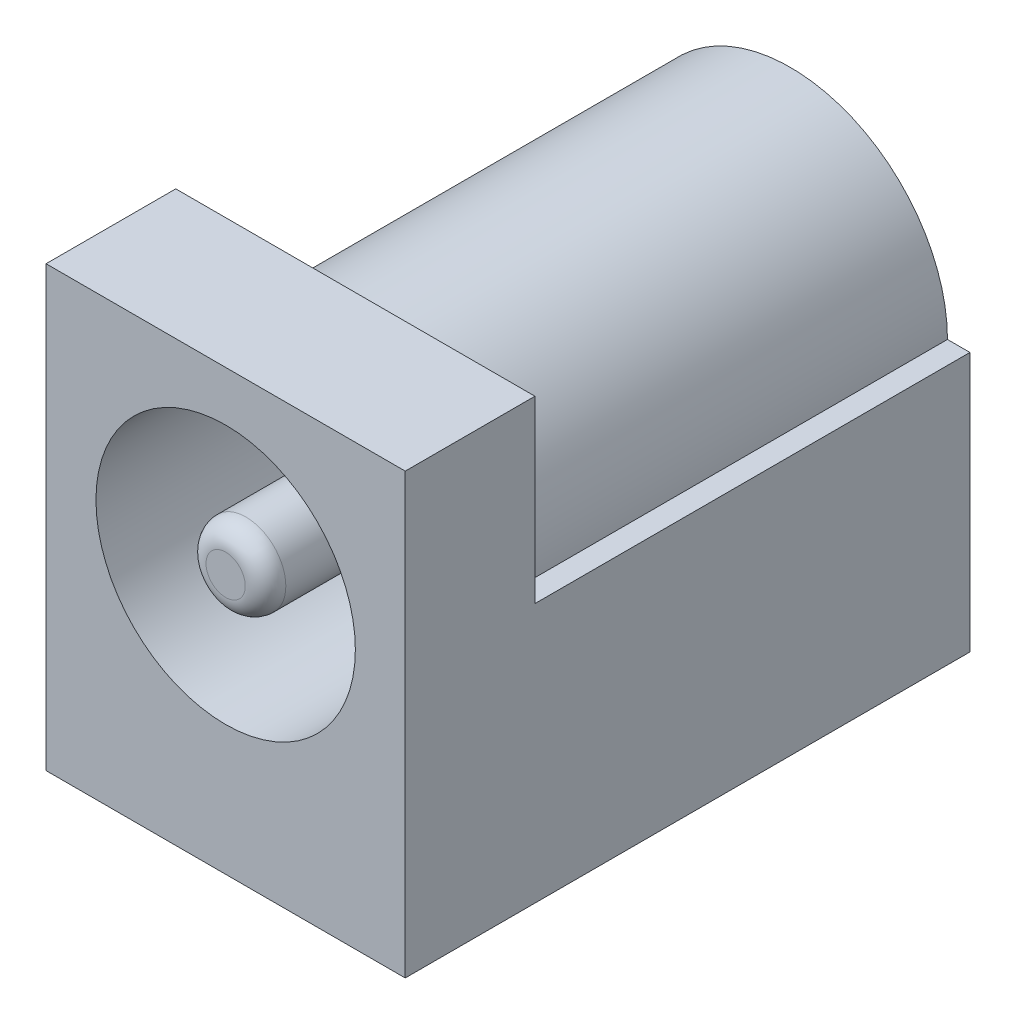
ISO-10303-21;
HEADER;
FILE_DESCRIPTION(('STEP AP214'),'2;1');
FILE_NAME('part.step','',(''),(''),'','','');
FILE_SCHEMA(('AUTOMOTIVE_DESIGN { 1 0 10303 214 1 1 1 1 }'));
ENDSEC;
DATA;
#1=APPLICATION_CONTEXT('core data for automotive mechanical design processes');
#2=APPLICATION_PROTOCOL_DEFINITION('international standard','automotive_design',2000,#1);
#3=PRODUCT_CONTEXT('',#1,'mechanical');
#4=PRODUCT('Part','Part','',(#3));
#5=PRODUCT_RELATED_PRODUCT_CATEGORY('part','',(#4));
#6=PRODUCT_DEFINITION_FORMATION('','',#4);
#7=PRODUCT_DEFINITION_CONTEXT('part definition',#1,'design');
#8=PRODUCT_DEFINITION('design','',#6,#7);
#9=PRODUCT_DEFINITION_SHAPE('','',#8);
#10=(LENGTH_UNIT() NAMED_UNIT(*) SI_UNIT(.MILLI.,.METRE.));
#11=(NAMED_UNIT(*) PLANE_ANGLE_UNIT() SI_UNIT($,.RADIAN.));
#12=(NAMED_UNIT(*) SI_UNIT($,.STERADIAN.) SOLID_ANGLE_UNIT());
#13=UNCERTAINTY_MEASURE_WITH_UNIT(LENGTH_MEASURE(1.E-05),#10,'distance_accuracy_value','');
#14=(GEOMETRIC_REPRESENTATION_CONTEXT(3) GLOBAL_UNCERTAINTY_ASSIGNED_CONTEXT((#13)) GLOBAL_UNIT_ASSIGNED_CONTEXT((#10,
#11,#12)) REPRESENTATION_CONTEXT('',''));
#15=CARTESIAN_POINT('',(0.,0.,0.));
#16=DIRECTION('',(0.,0.,1.));
#17=DIRECTION('',(1.,0.,0.));
#18=AXIS2_PLACEMENT_3D('',#15,#16,#17);
#19=CARTESIAN_POINT('',(4.5,-5.5,3.25));
#20=DIRECTION('',(-1.,0.,0.));
#21=DIRECTION('',(0.,0.,1.));
#22=AXIS2_PLACEMENT_3D('',#19,#20,#21);
#23=PLANE('',#22);
#24=DIRECTION('',(0.,0.,-1.));
#25=VECTOR('',#24,1.);
#26=CARTESIAN_POINT('',(4.5,-5.5,3.25));
#27=LINE('',#26,#25);
#28=CARTESIAN_POINT('',(4.5,-5.5,3.25));
#29=VERTEX_POINT('',#28);
#30=CARTESIAN_POINT('',(4.5,-5.5,-10.9));
#31=VERTEX_POINT('',#30);
#32=EDGE_CURVE('E99',#29,#31,#27,.T.);
#33=ORIENTED_EDGE('',*,*,#32,.T.);
#34=DIRECTION('',(0.,-1.,0.));
#35=VECTOR('',#34,1.);
#36=CARTESIAN_POINT('',(4.5,1.,-10.9));
#37=LINE('',#36,#35);
#38=CARTESIAN_POINT('',(4.5,1.,-10.9));
#39=VERTEX_POINT('',#38);
#40=EDGE_CURVE('E103',#39,#31,#37,.T.);
#41=ORIENTED_EDGE('',*,*,#40,.F.);
#42=DIRECTION('',(0.,0.,1.));
#43=VECTOR('',#42,1.);
#44=CARTESIAN_POINT('',(4.5,1.,-10.9));
#45=LINE('',#44,#43);
#46=CARTESIAN_POINT('',(4.5,1.,0.));
#47=VERTEX_POINT('',#46);
#48=EDGE_CURVE('E137',#39,#47,#45,.T.);
#49=ORIENTED_EDGE('',*,*,#48,.T.);
#50=DIRECTION('',(0.,1.,0.));
#51=VECTOR('',#50,1.);
#52=CARTESIAN_POINT('',(4.5,-5.5,0.));
#53=LINE('',#52,#51);
#54=CARTESIAN_POINT('',(4.5,5.5,0.));
#55=VERTEX_POINT('',#54);
#56=EDGE_CURVE('E161',#47,#55,#53,.T.);
#57=ORIENTED_EDGE('',*,*,#56,.T.);
#58=DIRECTION('',(0.,0.,-1.));
#59=VECTOR('',#58,1.);
#60=CARTESIAN_POINT('',(4.5,5.5,3.25));
#61=LINE('',#60,#59);
#62=CARTESIAN_POINT('',(4.5,5.5,3.25));
#63=VERTEX_POINT('',#62);
#64=EDGE_CURVE('E150',#63,#55,#61,.T.);
#65=ORIENTED_EDGE('',*,*,#64,.F.);
#66=DIRECTION('',(0.,1.,0.));
#67=VECTOR('',#66,1.);
#68=CARTESIAN_POINT('',(4.5,-5.5,3.25));
#69=LINE('',#68,#67);
#70=EDGE_CURVE('E106',#29,#63,#69,.T.);
#71=ORIENTED_EDGE('',*,*,#70,.F.);
#72=EDGE_LOOP('',(#33,#41,#49,#57,#65,#71));
#73=FACE_BOUND('',#72,.T.);
#74=ADVANCED_FACE('F33',(#73),#23,.F.);
#75=CARTESIAN_POINT('',(-4.5,5.5,3.25));
#76=DIRECTION('',(0.,-1.,0.));
#77=DIRECTION('',(0.,0.,-1.));
#78=AXIS2_PLACEMENT_3D('',#75,#76,#77);
#79=PLANE('',#78);
#80=DIRECTION('',(-1.,0.,0.));
#81=VECTOR('',#80,1.);
#82=CARTESIAN_POINT('',(-4.5,5.5,0.));
#83=LINE('',#82,#81);
#84=CARTESIAN_POINT('',(-4.5,5.5,0.));
#85=VERTEX_POINT('',#84);
#86=EDGE_CURVE('E164',#55,#85,#83,.T.);
#87=ORIENTED_EDGE('',*,*,#86,.T.);
#88=DIRECTION('',(0.,0.,-1.));
#89=VECTOR('',#88,1.);
#90=CARTESIAN_POINT('',(-4.5,5.5,3.25));
#91=LINE('',#90,#89);
#92=CARTESIAN_POINT('',(-4.5,5.5,3.25));
#93=VERTEX_POINT('',#92);
#94=EDGE_CURVE('E154',#93,#85,#91,.T.);
#95=ORIENTED_EDGE('',*,*,#94,.F.);
#96=DIRECTION('',(-1.,0.,0.));
#97=VECTOR('',#96,1.);
#98=CARTESIAN_POINT('',(-4.5,5.5,3.25));
#99=LINE('',#98,#97);
#100=EDGE_CURVE('E179',#63,#93,#99,.T.);
#101=ORIENTED_EDGE('',*,*,#100,.F.);
#102=ORIENTED_EDGE('',*,*,#64,.T.);
#103=EDGE_LOOP('',(#87,#95,#101,#102));
#104=FACE_BOUND('',#103,.T.);
#105=ADVANCED_FACE('F205',(#104),#79,.F.);
#106=CARTESIAN_POINT('',(-4.5,-5.5,3.25));
#107=DIRECTION('',(1.,0.,0.));
#108=DIRECTION('',(0.,0.,-1.));
#109=AXIS2_PLACEMENT_3D('',#106,#107,#108);
#110=PLANE('',#109);
#111=DIRECTION('',(0.,-1.,0.));
#112=VECTOR('',#111,1.);
#113=CARTESIAN_POINT('',(-4.5,-5.5,0.));
#114=LINE('',#113,#112);
#115=CARTESIAN_POINT('',(-4.5,1.,0.));
#116=VERTEX_POINT('',#115);
#117=EDGE_CURVE('E166',#85,#116,#114,.T.);
#118=ORIENTED_EDGE('',*,*,#117,.T.);
#119=DIRECTION('',(0.,0.,1.));
#120=VECTOR('',#119,1.);
#121=CARTESIAN_POINT('',(-4.5,1.,-10.9));
#122=LINE('',#121,#120);
#123=CARTESIAN_POINT('',(-4.5,1.,-10.9));
#124=VERTEX_POINT('',#123);
#125=EDGE_CURVE('E165',#124,#116,#122,.T.);
#126=ORIENTED_EDGE('',*,*,#125,.F.);
#127=DIRECTION('',(0.,1.,0.));
#128=VECTOR('',#127,1.);
#129=CARTESIAN_POINT('',(-4.5,1.,-10.9));
#130=LINE('',#129,#128);
#131=CARTESIAN_POINT('',(-4.5,-5.5,-10.9));
#132=VERTEX_POINT('',#131);
#133=EDGE_CURVE('E118',#132,#124,#130,.T.);
#134=ORIENTED_EDGE('',*,*,#133,.F.);
#135=DIRECTION('',(0.,0.,-1.));
#136=VECTOR('',#135,1.);
#137=CARTESIAN_POINT('',(-4.5,-5.5,3.25));
#138=LINE('',#137,#136);
#139=CARTESIAN_POINT('',(-4.5,-5.5,3.25));
#140=VERTEX_POINT('',#139);
#141=EDGE_CURVE('E109',#140,#132,#138,.T.);
#142=ORIENTED_EDGE('',*,*,#141,.F.);
#143=DIRECTION('',(0.,-1.,0.));
#144=VECTOR('',#143,1.);
#145=CARTESIAN_POINT('',(-4.5,-5.5,3.25));
#146=LINE('',#145,#144);
#147=EDGE_CURVE('E182',#93,#140,#146,.T.);
#148=ORIENTED_EDGE('',*,*,#147,.F.);
#149=ORIENTED_EDGE('',*,*,#94,.T.);
#150=EDGE_LOOP('',(#118,#126,#134,#142,#148,#149));
#151=FACE_BOUND('',#150,.T.);
#152=ADVANCED_FACE('F198',(#151),#110,.F.);
#153=CARTESIAN_POINT('',(-4.5,-5.5,3.25));
#154=DIRECTION('',(0.,1.,0.));
#155=DIRECTION('',(0.,0.,1.));
#156=AXIS2_PLACEMENT_3D('',#153,#154,#155);
#157=PLANE('',#156);
#158=ORIENTED_EDGE('',*,*,#141,.T.);
#159=DIRECTION('',(-1.,0.,0.));
#160=VECTOR('',#159,1.);
#161=CARTESIAN_POINT('',(4.5,-5.5,-10.9));
#162=LINE('',#161,#160);
#163=EDGE_CURVE('E113',#31,#132,#162,.T.);
#164=ORIENTED_EDGE('',*,*,#163,.F.);
#165=ORIENTED_EDGE('',*,*,#32,.F.);
#166=DIRECTION('',(1.,0.,0.));
#167=VECTOR('',#166,1.);
#168=CARTESIAN_POINT('',(-4.5,-5.5,3.25));
#169=LINE('',#168,#167);
#170=EDGE_CURVE('E110',#140,#29,#169,.T.);
#171=ORIENTED_EDGE('',*,*,#170,.F.);
#172=EDGE_LOOP('',(#158,#164,#165,#171));
#173=FACE_BOUND('',#172,.T.);
#174=ADVANCED_FACE('F114',(#173),#157,.F.);
#175=CARTESIAN_POINT('',(0.,0.,3.25));
#176=DIRECTION('',(0.,0.,-1.));
#177=DIRECTION('',(-1.,0.,0.));
#178=AXIS2_PLACEMENT_3D('',#175,#176,#177);
#179=PLANE('',#178);
#180=CARTESIAN_POINT('',(0.,1.,3.25));
#181=DIRECTION('',(0.,0.,1.));
#182=DIRECTION('',(1.,0.,0.));
#183=AXIS2_PLACEMENT_3D('',#180,#181,#182);
#184=CIRCLE('',#183,3.25);
#185=CARTESIAN_POINT('',(3.25,1.,3.25));
#186=VERTEX_POINT('',#185);
#187=EDGE_CURVE('E128',#186,#186,#184,.T.);
#188=ORIENTED_EDGE('',*,*,#187,.F.);
#189=EDGE_LOOP('',(#188));
#190=FACE_BOUND('',#189,.T.);
#191=ORIENTED_EDGE('',*,*,#70,.T.);
#192=ORIENTED_EDGE('',*,*,#100,.T.);
#193=ORIENTED_EDGE('',*,*,#147,.T.);
#194=ORIENTED_EDGE('',*,*,#170,.T.);
#195=EDGE_LOOP('',(#191,#192,#193,#194));
#196=FACE_BOUND('',#195,.T.);
#197=ADVANCED_FACE('F186',(#190,#196),#179,.F.);
#198=CARTESIAN_POINT('',(0.,0.,0.));
#199=DIRECTION('',(0.,0.,-1.));
#200=DIRECTION('',(-1.,0.,0.));
#201=AXIS2_PLACEMENT_3D('',#198,#199,#200);
#202=PLANE('',#201);
#203=DIRECTION('',(1.,0.,0.));
#204=VECTOR('',#203,1.);
#205=CARTESIAN_POINT('',(4.5,1.,0.));
#206=LINE('',#205,#204);
#207=CARTESIAN_POINT('',(3.937,1.,0.));
#208=VERTEX_POINT('',#207);
#209=EDGE_CURVE('E48',#208,#47,#206,.T.);
#210=ORIENTED_EDGE('',*,*,#209,.F.);
#211=CARTESIAN_POINT('',(0.,1.,0.));
#212=DIRECTION('',(0.,0.,-1.));
#213=DIRECTION('',(-1.,0.,0.));
#214=AXIS2_PLACEMENT_3D('',#211,#212,#213);
#215=CIRCLE('',#214,3.937);
#216=CARTESIAN_POINT('',(-3.937,1.,0.));
#217=VERTEX_POINT('',#216);
#218=EDGE_CURVE('E125',#217,#208,#215,.T.);
#219=ORIENTED_EDGE('',*,*,#218,.F.);
#220=DIRECTION('',(1.,0.,0.));
#221=VECTOR('',#220,1.);
#222=CARTESIAN_POINT('',(-3.937,1.,0.));
#223=LINE('',#222,#221);
#224=EDGE_CURVE('E54',#116,#217,#223,.T.);
#225=ORIENTED_EDGE('',*,*,#224,.F.);
#226=ORIENTED_EDGE('',*,*,#117,.F.);
#227=ORIENTED_EDGE('',*,*,#86,.F.);
#228=ORIENTED_EDGE('',*,*,#56,.F.);
#229=EDGE_LOOP('',(#210,#219,#225,#226,#227,#228));
#230=FACE_BOUND('',#229,.T.);
#231=ADVANCED_FACE('F188',(#230),#202,.T.);
#232=CARTESIAN_POINT('',(-3.937,1.,-10.9));
#233=DIRECTION('',(0.,-1.,0.));
#234=DIRECTION('',(0.,0.,-1.));
#235=AXIS2_PLACEMENT_3D('',#232,#233,#234);
#236=PLANE('',#235);
#237=ORIENTED_EDGE('',*,*,#224,.T.);
#238=DIRECTION('',(0.,0.,1.));
#239=VECTOR('',#238,1.);
#240=CARTESIAN_POINT('',(-3.937,1.,-10.9));
#241=LINE('',#240,#239);
#242=CARTESIAN_POINT('',(-3.937,1.,-10.9));
#243=VERTEX_POINT('',#242);
#244=EDGE_CURVE('E184',#243,#217,#241,.T.);
#245=ORIENTED_EDGE('',*,*,#244,.F.);
#246=DIRECTION('',(1.,0.,0.));
#247=VECTOR('',#246,1.);
#248=CARTESIAN_POINT('',(-3.937,1.,-10.9));
#249=LINE('',#248,#247);
#250=EDGE_CURVE('E132',#124,#243,#249,.T.);
#251=ORIENTED_EDGE('',*,*,#250,.F.);
#252=ORIENTED_EDGE('',*,*,#125,.T.);
#253=EDGE_LOOP('',(#237,#245,#251,#252));
#254=FACE_BOUND('',#253,.T.);
#255=ADVANCED_FACE('F196',(#254),#236,.F.);
#256=CARTESIAN_POINT('',(0.,1.,-10.9));
#257=DIRECTION('',(0.,0.,1.));
#258=DIRECTION('',(1.,0.,0.));
#259=AXIS2_PLACEMENT_3D('',#256,#257,#258);
#260=CYLINDRICAL_SURFACE('',#259,3.937);
#261=ORIENTED_EDGE('',*,*,#218,.T.);
#262=DIRECTION('',(0.,0.,1.));
#263=VECTOR('',#262,1.);
#264=CARTESIAN_POINT('',(3.937,1.,-10.9));
#265=LINE('',#264,#263);
#266=CARTESIAN_POINT('',(3.937,1.,-10.9));
#267=VERTEX_POINT('',#266);
#268=EDGE_CURVE('E141',#267,#208,#265,.T.);
#269=ORIENTED_EDGE('',*,*,#268,.F.);
#270=CARTESIAN_POINT('',(0.,1.,-10.9));
#271=DIRECTION('',(0.,0.,-1.));
#272=DIRECTION('',(-1.,0.,0.));
#273=AXIS2_PLACEMENT_3D('',#270,#271,#272);
#274=CIRCLE('',#273,3.937);
#275=EDGE_CURVE('E134',#243,#267,#274,.T.);
#276=ORIENTED_EDGE('',*,*,#275,.F.);
#277=ORIENTED_EDGE('',*,*,#244,.T.);
#278=EDGE_LOOP('',(#261,#269,#276,#277));
#279=FACE_BOUND('',#278,.T.);
#280=ADVANCED_FACE('F238',(#279),#260,.T.);
#281=CARTESIAN_POINT('',(4.5,1.,-10.9));
#282=DIRECTION('',(0.,-1.,0.));
#283=DIRECTION('',(0.,0.,-1.));
#284=AXIS2_PLACEMENT_3D('',#281,#282,#283);
#285=PLANE('',#284);
#286=ORIENTED_EDGE('',*,*,#209,.T.);
#287=ORIENTED_EDGE('',*,*,#48,.F.);
#288=DIRECTION('',(1.,0.,0.));
#289=VECTOR('',#288,1.);
#290=CARTESIAN_POINT('',(4.5,1.,-10.9));
#291=LINE('',#290,#289);
#292=EDGE_CURVE('E122',#267,#39,#291,.T.);
#293=ORIENTED_EDGE('',*,*,#292,.F.);
#294=ORIENTED_EDGE('',*,*,#268,.T.);
#295=EDGE_LOOP('',(#286,#287,#293,#294));
#296=FACE_BOUND('',#295,.T.);
#297=ADVANCED_FACE('F247',(#296),#285,.F.);
#298=CARTESIAN_POINT('',(0.,1.,-10.9));
#299=DIRECTION('',(0.,0.,-1.));
#300=DIRECTION('',(-1.,0.,0.));
#301=AXIS2_PLACEMENT_3D('',#298,#299,#300);
#302=PLANE('',#301);
#303=ORIENTED_EDGE('',*,*,#40,.T.);
#304=ORIENTED_EDGE('',*,*,#163,.T.);
#305=ORIENTED_EDGE('',*,*,#133,.T.);
#306=ORIENTED_EDGE('',*,*,#250,.T.);
#307=ORIENTED_EDGE('',*,*,#275,.T.);
#308=ORIENTED_EDGE('',*,*,#292,.T.);
#309=EDGE_LOOP('',(#303,#304,#305,#306,#307,#308));
#310=FACE_BOUND('',#309,.T.);
#311=ADVANCED_FACE('F120',(#310),#302,.T.);
#312=CARTESIAN_POINT('',(0.,1.,-7.65));
#313=DIRECTION('',(0.,0.,1.));
#314=DIRECTION('',(1.,0.,0.));
#315=AXIS2_PLACEMENT_3D('',#312,#313,#314);
#316=CYLINDRICAL_SURFACE('',#315,3.25);
#317=CARTESIAN_POINT('',(0.,1.,-7.65));
#318=DIRECTION('',(0.,0.,1.));
#319=DIRECTION('',(1.,0.,0.));
#320=AXIS2_PLACEMENT_3D('',#317,#318,#319);
#321=CIRCLE('',#320,3.25);
#322=CARTESIAN_POINT('',(3.25,1.,-7.65));
#323=VERTEX_POINT('',#322);
#324=EDGE_CURVE('E323',#323,#323,#321,.T.);
#325=ORIENTED_EDGE('',*,*,#324,.F.);
#326=EDGE_LOOP('',(#325));
#327=FACE_BOUND('',#326,.T.);
#328=ORIENTED_EDGE('',*,*,#187,.T.);
#329=EDGE_LOOP('',(#328));
#330=FACE_BOUND('',#329,.T.);
#331=ADVANCED_FACE('F265',(#327,#330),#316,.F.);
#332=CARTESIAN_POINT('',(0.,1.,-7.65));
#333=DIRECTION('',(0.,0.,1.));
#334=DIRECTION('',(1.,0.,0.));
#335=AXIS2_PLACEMENT_3D('',#332,#333,#334);
#336=PLANE('',#335);
#337=CARTESIAN_POINT('',(0.,1.,-7.65));
#338=DIRECTION('',(0.,0.,1.));
#339=DIRECTION('',(1.,0.,0.));
#340=AXIS2_PLACEMENT_3D('',#337,#338,#339);
#341=CIRCLE('',#340,1.);
#342=CARTESIAN_POINT('',(1.,1.,-7.65));
#343=VERTEX_POINT('',#342);
#344=EDGE_CURVE('E320',#343,#343,#341,.T.);
#345=ORIENTED_EDGE('',*,*,#344,.F.);
#346=EDGE_LOOP('',(#345));
#347=FACE_BOUND('',#346,.T.);
#348=ORIENTED_EDGE('',*,*,#324,.T.);
#349=EDGE_LOOP('',(#348));
#350=FACE_BOUND('',#349,.T.);
#351=ADVANCED_FACE('F279',(#347,#350),#336,.T.);
#352=CARTESIAN_POINT('',(0.,1.,-7.65));
#353=DIRECTION('',(0.,0.,1.));
#354=DIRECTION('',(1.,0.,0.));
#355=AXIS2_PLACEMENT_3D('',#352,#353,#354);
#356=CYLINDRICAL_SURFACE('',#355,1.);
#357=CARTESIAN_POINT('',(0.,1.,2.742));
#358=DIRECTION('',(0.,0.,-1.));
#359=DIRECTION('',(-1.,0.,0.));
#360=AXIS2_PLACEMENT_3D('',#357,#358,#359);
#361=CIRCLE('',#360,1.);
#362=CARTESIAN_POINT('',(-1.,1.,2.742));
#363=VERTEX_POINT('',#362);
#364=EDGE_CURVE('E11',#363,#363,#361,.T.);
#365=ORIENTED_EDGE('',*,*,#364,.T.);
#366=EDGE_LOOP('',(#365));
#367=FACE_BOUND('',#366,.T.);
#368=ORIENTED_EDGE('',*,*,#344,.T.);
#369=EDGE_LOOP('',(#368));
#370=FACE_BOUND('',#369,.T.);
#371=ADVANCED_FACE('F203',(#367,#370),#356,.T.);
#372=CARTESIAN_POINT('',(0.,1.,3.25));
#373=DIRECTION('',(0.,0.,-1.));
#374=DIRECTION('',(-1.,0.,0.));
#375=AXIS2_PLACEMENT_3D('',#372,#373,#374);
#376=CIRCLE('',#375,0.492);
#377=CARTESIAN_POINT('',(-0.492,1.,3.25));
#378=VERTEX_POINT('',#377);
#379=EDGE_CURVE('E41',#378,#378,#376,.F.);
#380=ORIENTED_EDGE('',*,*,#379,.T.);
#381=EDGE_LOOP('',(#380));
#382=FACE_BOUND('',#381,.T.);
#383=ADVANCED_FACE('F191',(#382),#179,.F.);
#384=CARTESIAN_POINT('',(0.,1.,2.742));
#385=DIRECTION('',(0.,0.,-1.));
#386=DIRECTION('',(-1.,0.,0.));
#387=AXIS2_PLACEMENT_3D('',#384,#385,#386);
#388=DEGENERATE_TOROIDAL_SURFACE('',#387,0.492,0.508,.T.);
#389=ORIENTED_EDGE('',*,*,#364,.F.);
#390=EDGE_LOOP('',(#389));
#391=FACE_BOUND('',#390,.T.);
#392=ORIENTED_EDGE('',*,*,#379,.F.);
#393=EDGE_LOOP('',(#392));
#394=FACE_BOUND('',#393,.T.);
#395=ADVANCED_FACE('F35',(#391,#394),#388,.T.);
#396=CLOSED_SHELL('',(#74,#105,#152,#174,#197,#231,#255,#280,#297,#311,#331,#351,#371,#383,#395));
#397=MANIFOLD_SOLID_BREP('B2',#396);
#398=ADVANCED_BREP_SHAPE_REPRESENTATION('',(#18,#397),#14);
#399=SHAPE_DEFINITION_REPRESENTATION(#9,#398);
ENDSEC;
END-ISO-10303-21;
